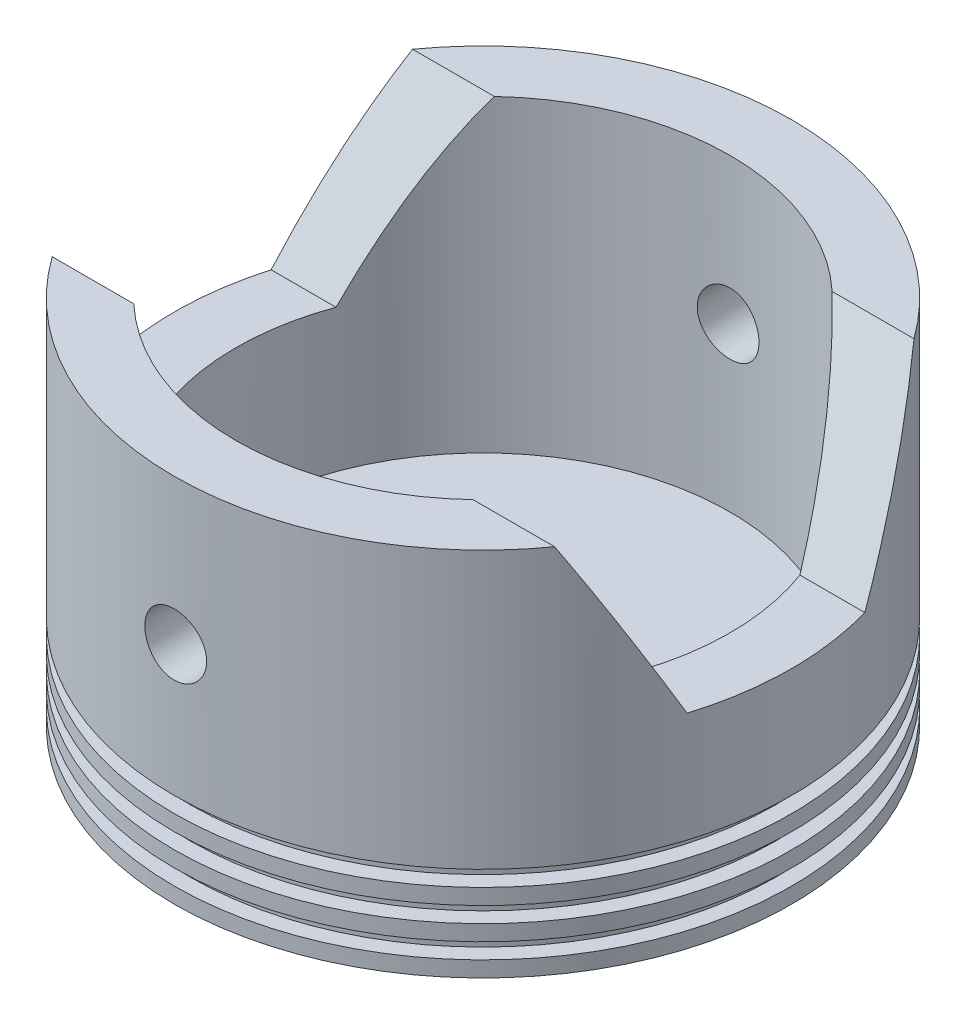
ISO-10303-21;
HEADER;
FILE_DESCRIPTION(('STEP AP214'),'2;1');
FILE_NAME('part.step','',(''),(''),'','','');
FILE_SCHEMA(('AUTOMOTIVE_DESIGN { 1 0 10303 214 1 1 1 1 }'));
ENDSEC;
DATA;
#1=APPLICATION_CONTEXT('core data for automotive mechanical design processes');
#2=APPLICATION_PROTOCOL_DEFINITION('international standard','automotive_design',2000,#1);
#3=PRODUCT_CONTEXT('',#1,'mechanical');
#4=PRODUCT('Part','Part','',(#3));
#5=PRODUCT_RELATED_PRODUCT_CATEGORY('part','',(#4));
#6=PRODUCT_DEFINITION_FORMATION('','',#4);
#7=PRODUCT_DEFINITION_CONTEXT('part definition',#1,'design');
#8=PRODUCT_DEFINITION('design','',#6,#7);
#9=PRODUCT_DEFINITION_SHAPE('','',#8);
#10=(LENGTH_UNIT() NAMED_UNIT(*) SI_UNIT(.MILLI.,.METRE.));
#11=(NAMED_UNIT(*) PLANE_ANGLE_UNIT() SI_UNIT($,.RADIAN.));
#12=(NAMED_UNIT(*) SI_UNIT($,.STERADIAN.) SOLID_ANGLE_UNIT());
#13=UNCERTAINTY_MEASURE_WITH_UNIT(LENGTH_MEASURE(1.E-05),#10,'distance_accuracy_value','');
#14=(GEOMETRIC_REPRESENTATION_CONTEXT(3) GLOBAL_UNCERTAINTY_ASSIGNED_CONTEXT((#13)) GLOBAL_UNIT_ASSIGNED_CONTEXT((#10,
#11,#12)) REPRESENTATION_CONTEXT('',''));
#15=CARTESIAN_POINT('',(0.,0.,0.));
#16=DIRECTION('',(0.,0.,1.));
#17=DIRECTION('',(1.,0.,0.));
#18=AXIS2_PLACEMENT_3D('',#15,#16,#17);
#19=CARTESIAN_POINT('',(0.,30.,0.));
#20=DIRECTION('',(0.,1.,0.));
#21=DIRECTION('',(0.,0.,1.));
#22=AXIS2_PLACEMENT_3D('',#19,#20,#21);
#23=PLANE('',#22);
#24=DIRECTION('',(1.,0.,0.));
#25=VECTOR('',#24,1.);
#26=CARTESIAN_POINT('',(-25.,30.,14.5401699052836));
#27=LINE('',#26,#25);
#28=CARTESIAN_POINT('',(-20.3367514398314,30.,14.5401699052836));
#29=VERTEX_POINT('',#28);
#30=CARTESIAN_POINT('',(-13.7325692834767,30.,14.5401699052836));
#31=VERTEX_POINT('',#30);
#32=EDGE_CURVE('E237',#29,#31,#27,.T.);
#33=ORIENTED_EDGE('',*,*,#32,.F.);
#34=CARTESIAN_POINT('',(0.,30.,0.));
#35=DIRECTION('',(0.,1.,0.));
#36=DIRECTION('',(0.,0.,1.));
#37=AXIS2_PLACEMENT_3D('',#34,#35,#36);
#38=CIRCLE('',#37,25.);
#39=CARTESIAN_POINT('',(20.3367514398314,30.,14.5401699052836));
#40=VERTEX_POINT('',#39);
#41=EDGE_CURVE('E191',#29,#40,#38,.T.);
#42=ORIENTED_EDGE('',*,*,#41,.T.);
#43=CARTESIAN_POINT('',(13.7325692834767,30.,14.5401699052836));
#44=VERTEX_POINT('',#43);
#45=EDGE_CURVE('E238',#44,#40,#27,.T.);
#46=ORIENTED_EDGE('',*,*,#45,.F.);
#47=CARTESIAN_POINT('',(0.,30.,0.));
#48=DIRECTION('',(0.,1.,0.));
#49=DIRECTION('',(0.,0.,1.));
#50=AXIS2_PLACEMENT_3D('',#47,#48,#49);
#51=CIRCLE('',#50,20.);
#52=EDGE_CURVE('E152',#31,#44,#51,.T.);
#53=ORIENTED_EDGE('',*,*,#52,.F.);
#54=EDGE_LOOP('',(#33,#42,#46,#53));
#55=FACE_BOUND('',#54,.T.);
#56=ADVANCED_FACE('F41',(#55),#23,.T.);
#57=CARTESIAN_POINT('',(0.,30.,0.));
#58=DIRECTION('',(0.,-1.,0.));
#59=DIRECTION('',(0.,0.,-1.));
#60=AXIS2_PLACEMENT_3D('',#57,#58,#59);
#61=CYLINDRICAL_SURFACE('',#60,25.);
#62=CARTESIAN_POINT('',(0.,1.27,0.));
#63=DIRECTION('',(0.,-1.,0.));
#64=DIRECTION('',(0.,0.,-1.));
#65=AXIS2_PLACEMENT_3D('',#62,#63,#64);
#66=CIRCLE('',#65,25.);
#67=CARTESIAN_POINT('',(0.,1.27,-25.));
#68=VERTEX_POINT('',#67);
#69=EDGE_CURVE('E165',#68,#68,#66,.T.);
#70=ORIENTED_EDGE('',*,*,#69,.T.);
#71=EDGE_LOOP('',(#70));
#72=FACE_BOUND('',#71,.T.);
#73=CARTESIAN_POINT('',(0.,0.,0.));
#74=DIRECTION('',(0.,1.,0.));
#75=DIRECTION('',(0.,0.,1.));
#76=AXIS2_PLACEMENT_3D('',#73,#74,#75);
#77=CIRCLE('',#76,25.);
#78=CARTESIAN_POINT('',(0.,0.,25.));
#79=VERTEX_POINT('',#78);
#80=EDGE_CURVE('E168',#79,#79,#77,.T.);
#81=ORIENTED_EDGE('',*,*,#80,.T.);
#82=EDGE_LOOP('',(#81));
#83=FACE_BOUND('',#82,.T.);
#84=ADVANCED_FACE('F264',(#72,#83),#61,.T.);
#85=CARTESIAN_POINT('',(0.,0.,0.));
#86=DIRECTION('',(0.,1.,0.));
#87=DIRECTION('',(0.,0.,1.));
#88=AXIS2_PLACEMENT_3D('',#85,#86,#87);
#89=PLANE('',#88);
#90=ORIENTED_EDGE('',*,*,#80,.F.);
#91=EDGE_LOOP('',(#90));
#92=FACE_BOUND('',#91,.T.);
#93=ADVANCED_FACE('F270',(#92),#89,.F.);
#94=CARTESIAN_POINT('',(25.,1.27,0.));
#95=DIRECTION('',(0.,-1.,0.));
#96=DIRECTION('',(0.,0.,-1.));
#97=AXIS2_PLACEMENT_3D('',#94,#95,#96);
#98=PLANE('',#97);
#99=ORIENTED_EDGE('',*,*,#69,.F.);
#100=EDGE_LOOP('',(#99));
#101=FACE_BOUND('',#100,.T.);
#102=CARTESIAN_POINT('',(0.,1.27,0.));
#103=DIRECTION('',(0.,-1.,0.));
#104=DIRECTION('',(0.,0.,-1.));
#105=AXIS2_PLACEMENT_3D('',#102,#103,#104);
#106=CIRCLE('',#105,23.73);
#107=CARTESIAN_POINT('',(0.,1.27,-23.73));
#108=VERTEX_POINT('',#107);
#109=EDGE_CURVE('E162',#108,#108,#106,.T.);
#110=ORIENTED_EDGE('',*,*,#109,.T.);
#111=EDGE_LOOP('',(#110));
#112=FACE_BOUND('',#111,.T.);
#113=ADVANCED_FACE('F338',(#101,#112),#98,.F.);
#114=CARTESIAN_POINT('',(0.,0.,0.));
#115=DIRECTION('',(0.,-1.,0.));
#116=DIRECTION('',(0.,0.,-1.));
#117=AXIS2_PLACEMENT_3D('',#114,#115,#116);
#118=CYLINDRICAL_SURFACE('',#117,23.73);
#119=ORIENTED_EDGE('',*,*,#109,.F.);
#120=EDGE_LOOP('',(#119));
#121=FACE_BOUND('',#120,.T.);
#122=CARTESIAN_POINT('',(0.,2.54,0.));
#123=DIRECTION('',(0.,-1.,0.));
#124=DIRECTION('',(0.,0.,-1.));
#125=AXIS2_PLACEMENT_3D('',#122,#123,#124);
#126=CIRCLE('',#125,23.73);
#127=CARTESIAN_POINT('',(0.,2.54,-23.73));
#128=VERTEX_POINT('',#127);
#129=EDGE_CURVE('E158',#128,#128,#126,.T.);
#130=ORIENTED_EDGE('',*,*,#129,.T.);
#131=EDGE_LOOP('',(#130));
#132=FACE_BOUND('',#131,.T.);
#133=ADVANCED_FACE('F323',(#121,#132),#118,.T.);
#134=CARTESIAN_POINT('',(25.,2.54,0.));
#135=DIRECTION('',(0.,1.,0.));
#136=DIRECTION('',(0.,0.,1.));
#137=AXIS2_PLACEMENT_3D('',#134,#135,#136);
#138=PLANE('',#137);
#139=ORIENTED_EDGE('',*,*,#129,.F.);
#140=EDGE_LOOP('',(#139));
#141=FACE_BOUND('',#140,.T.);
#142=CARTESIAN_POINT('',(0.,2.54,0.));
#143=DIRECTION('',(0.,-1.,0.));
#144=DIRECTION('',(0.,0.,-1.));
#145=AXIS2_PLACEMENT_3D('',#142,#143,#144);
#146=CIRCLE('',#145,25.);
#147=CARTESIAN_POINT('',(0.,2.54,-25.));
#148=VERTEX_POINT('',#147);
#149=EDGE_CURVE('E155',#148,#148,#146,.T.);
#150=ORIENTED_EDGE('',*,*,#149,.T.);
#151=EDGE_LOOP('',(#150));
#152=FACE_BOUND('',#151,.T.);
#153=ADVANCED_FACE('F316',(#141,#152),#138,.F.);
#154=ORIENTED_EDGE('',*,*,#149,.F.);
#155=EDGE_LOOP('',(#154));
#156=FACE_BOUND('',#155,.T.);
#157=CARTESIAN_POINT('',(0.,3.81,0.));
#158=DIRECTION('',(0.,-1.,0.));
#159=DIRECTION('',(0.,0.,-1.));
#160=AXIS2_PLACEMENT_3D('',#157,#158,#159);
#161=CIRCLE('',#160,25.);
#162=CARTESIAN_POINT('',(0.,3.81,-25.));
#163=VERTEX_POINT('',#162);
#164=EDGE_CURVE('E159',#163,#163,#161,.T.);
#165=ORIENTED_EDGE('',*,*,#164,.T.);
#166=EDGE_LOOP('',(#165));
#167=FACE_BOUND('',#166,.T.);
#168=ADVANCED_FACE('F272',(#156,#167),#61,.T.);
#169=CARTESIAN_POINT('',(25.,3.81,0.));
#170=DIRECTION('',(0.,-1.,0.));
#171=DIRECTION('',(0.,0.,-1.));
#172=AXIS2_PLACEMENT_3D('',#169,#170,#171);
#173=PLANE('',#172);
#174=ORIENTED_EDGE('',*,*,#164,.F.);
#175=EDGE_LOOP('',(#174));
#176=FACE_BOUND('',#175,.T.);
#177=CARTESIAN_POINT('',(0.,3.81,0.));
#178=DIRECTION('',(0.,-1.,0.));
#179=DIRECTION('',(0.,0.,-1.));
#180=AXIS2_PLACEMENT_3D('',#177,#178,#179);
#181=CIRCLE('',#180,23.73);
#182=CARTESIAN_POINT('',(0.,3.81,-23.73));
#183=VERTEX_POINT('',#182);
#184=EDGE_CURVE('E176',#183,#183,#181,.T.);
#185=ORIENTED_EDGE('',*,*,#184,.T.);
#186=EDGE_LOOP('',(#185));
#187=FACE_BOUND('',#186,.T.);
#188=ADVANCED_FACE('F294',(#176,#187),#173,.F.);
#189=CARTESIAN_POINT('',(0.,0.,0.));
#190=DIRECTION('',(0.,-1.,0.));
#191=DIRECTION('',(0.,0.,-1.));
#192=AXIS2_PLACEMENT_3D('',#189,#190,#191);
#193=CYLINDRICAL_SURFACE('',#192,23.73);
#194=ORIENTED_EDGE('',*,*,#184,.F.);
#195=EDGE_LOOP('',(#194));
#196=FACE_BOUND('',#195,.T.);
#197=CARTESIAN_POINT('',(0.,5.08,0.));
#198=DIRECTION('',(0.,-1.,0.));
#199=DIRECTION('',(0.,0.,-1.));
#200=AXIS2_PLACEMENT_3D('',#197,#198,#199);
#201=CIRCLE('',#200,23.73);
#202=CARTESIAN_POINT('',(0.,5.08,-23.73));
#203=VERTEX_POINT('',#202);
#204=EDGE_CURVE('E172',#203,#203,#201,.T.);
#205=ORIENTED_EDGE('',*,*,#204,.T.);
#206=EDGE_LOOP('',(#205));
#207=FACE_BOUND('',#206,.T.);
#208=ADVANCED_FACE('F311',(#196,#207),#193,.T.);
#209=CARTESIAN_POINT('',(25.,5.08,0.));
#210=DIRECTION('',(0.,1.,0.));
#211=DIRECTION('',(0.,0.,1.));
#212=AXIS2_PLACEMENT_3D('',#209,#210,#211);
#213=PLANE('',#212);
#214=ORIENTED_EDGE('',*,*,#204,.F.);
#215=EDGE_LOOP('',(#214));
#216=FACE_BOUND('',#215,.T.);
#217=CARTESIAN_POINT('',(0.,5.08,0.));
#218=DIRECTION('',(0.,-1.,0.));
#219=DIRECTION('',(0.,0.,-1.));
#220=AXIS2_PLACEMENT_3D('',#217,#218,#219);
#221=CIRCLE('',#220,25.);
#222=CARTESIAN_POINT('',(0.,5.08,-25.));
#223=VERTEX_POINT('',#222);
#224=EDGE_CURVE('E169',#223,#223,#221,.T.);
#225=ORIENTED_EDGE('',*,*,#224,.T.);
#226=EDGE_LOOP('',(#225));
#227=FACE_BOUND('',#226,.T.);
#228=ADVANCED_FACE('F301',(#216,#227),#213,.F.);
#229=ORIENTED_EDGE('',*,*,#224,.F.);
#230=EDGE_LOOP('',(#229));
#231=FACE_BOUND('',#230,.T.);
#232=CARTESIAN_POINT('',(0.,6.35,0.));
#233=DIRECTION('',(0.,-1.,0.));
#234=DIRECTION('',(0.,0.,-1.));
#235=AXIS2_PLACEMENT_3D('',#232,#233,#234);
#236=CIRCLE('',#235,25.);
#237=CARTESIAN_POINT('',(0.,6.35,-25.));
#238=VERTEX_POINT('',#237);
#239=EDGE_CURVE('E173',#238,#238,#236,.T.);
#240=ORIENTED_EDGE('',*,*,#239,.T.);
#241=EDGE_LOOP('',(#240));
#242=FACE_BOUND('',#241,.T.);
#243=ADVANCED_FACE('F280',(#231,#242),#61,.T.);
#244=CARTESIAN_POINT('',(25.,6.35,0.));
#245=DIRECTION('',(0.,-1.,0.));
#246=DIRECTION('',(0.,0.,-1.));
#247=AXIS2_PLACEMENT_3D('',#244,#245,#246);
#248=PLANE('',#247);
#249=ORIENTED_EDGE('',*,*,#239,.F.);
#250=EDGE_LOOP('',(#249));
#251=FACE_BOUND('',#250,.T.);
#252=CARTESIAN_POINT('',(0.,6.35,0.));
#253=DIRECTION('',(0.,-1.,0.));
#254=DIRECTION('',(0.,0.,-1.));
#255=AXIS2_PLACEMENT_3D('',#252,#253,#254);
#256=CIRCLE('',#255,23.73);
#257=CARTESIAN_POINT('',(0.,6.35,-23.73));
#258=VERTEX_POINT('',#257);
#259=EDGE_CURVE('E186',#258,#258,#256,.T.);
#260=ORIENTED_EDGE('',*,*,#259,.T.);
#261=EDGE_LOOP('',(#260));
#262=FACE_BOUND('',#261,.T.);
#263=ADVANCED_FACE('F288',(#251,#262),#248,.F.);
#264=CARTESIAN_POINT('',(0.,0.,0.));
#265=DIRECTION('',(0.,-1.,0.));
#266=DIRECTION('',(0.,0.,-1.));
#267=AXIS2_PLACEMENT_3D('',#264,#265,#266);
#268=CYLINDRICAL_SURFACE('',#267,23.73);
#269=ORIENTED_EDGE('',*,*,#259,.F.);
#270=EDGE_LOOP('',(#269));
#271=FACE_BOUND('',#270,.T.);
#272=CARTESIAN_POINT('',(0.,7.62,0.));
#273=DIRECTION('',(0.,-1.,0.));
#274=DIRECTION('',(0.,0.,-1.));
#275=AXIS2_PLACEMENT_3D('',#272,#273,#274);
#276=CIRCLE('',#275,23.73);
#277=CARTESIAN_POINT('',(0.,7.62,-23.73));
#278=VERTEX_POINT('',#277);
#279=EDGE_CURVE('E183',#278,#278,#276,.T.);
#280=ORIENTED_EDGE('',*,*,#279,.T.);
#281=EDGE_LOOP('',(#280));
#282=FACE_BOUND('',#281,.T.);
#283=ADVANCED_FACE('F282',(#271,#282),#268,.T.);
#284=CARTESIAN_POINT('',(25.,7.62,0.));
#285=DIRECTION('',(0.,1.,0.));
#286=DIRECTION('',(0.,0.,1.));
#287=AXIS2_PLACEMENT_3D('',#284,#285,#286);
#288=PLANE('',#287);
#289=ORIENTED_EDGE('',*,*,#279,.F.);
#290=EDGE_LOOP('',(#289));
#291=FACE_BOUND('',#290,.T.);
#292=CARTESIAN_POINT('',(0.,7.62,0.));
#293=DIRECTION('',(0.,-1.,0.));
#294=DIRECTION('',(0.,0.,-1.));
#295=AXIS2_PLACEMENT_3D('',#292,#293,#294);
#296=CIRCLE('',#295,25.);
#297=CARTESIAN_POINT('',(0.,7.62,-25.));
#298=VERTEX_POINT('',#297);
#299=EDGE_CURVE('E150',#298,#298,#296,.T.);
#300=ORIENTED_EDGE('',*,*,#299,.T.);
#301=EDGE_LOOP('',(#300));
#302=FACE_BOUND('',#301,.T.);
#303=ADVANCED_FACE('F275',(#291,#302),#288,.F.);
#304=DIRECTION('',(1.,0.,0.));
#305=VECTOR('',#304,1.);
#306=CARTESIAN_POINT('',(-25.,30.,-14.5941222982531));
#307=LINE('',#306,#305);
#308=CARTESIAN_POINT('',(13.6752182557951,30.,-14.5941222982531));
#309=VERTEX_POINT('',#308);
#310=CARTESIAN_POINT('',(20.2980687343312,30.,-14.5941222982531));
#311=VERTEX_POINT('',#310);
#312=EDGE_CURVE('E137',#309,#311,#307,.T.);
#313=ORIENTED_EDGE('',*,*,#312,.T.);
#314=CARTESIAN_POINT('',(-20.2980687343312,30.,-14.5941222982531));
#315=VERTEX_POINT('',#314);
#316=EDGE_CURVE('E194',#311,#315,#38,.T.);
#317=ORIENTED_EDGE('',*,*,#316,.T.);
#318=CARTESIAN_POINT('',(-13.6752182557951,30.,-14.5941222982531));
#319=VERTEX_POINT('',#318);
#320=EDGE_CURVE('E131',#315,#319,#307,.T.);
#321=ORIENTED_EDGE('',*,*,#320,.T.);
#322=EDGE_CURVE('E151',#309,#319,#51,.T.);
#323=ORIENTED_EDGE('',*,*,#322,.F.);
#324=EDGE_LOOP('',(#313,#317,#321,#323));
#325=FACE_BOUND('',#324,.T.);
#326=ADVANCED_FACE('F246',(#325),#23,.T.);
#327=CARTESIAN_POINT('',(0.,20.710167381686,-25.));
#328=CARTESIAN_POINT('',(-0.140050884478893,20.710161316935,-24.9999983880192));
#329=CARTESIAN_POINT('',(-0.280194362919433,20.6983592094449,-24.9988106399051));
#330=CARTESIAN_POINT('',(-0.556595996242093,20.6514564559599,-24.9941866898684));
#331=CARTESIAN_POINT('',(-0.69284969792207,20.6163301416245,-24.9907480108506));
#332=CARTESIAN_POINT('',(-0.957429188633536,20.5238117801914,-24.9820103640768));
#333=CARTESIAN_POINT('',(-1.08575971153727,20.4664331803898,-24.9767125200177));
#334=CARTESIAN_POINT('',(-1.33094040240101,20.3310651118569,-24.9648489348577));
#335=CARTESIAN_POINT('',(-1.44779284694769,20.2530797416856,-24.9582834459533));
#336=CARTESIAN_POINT('',(-1.6671488766852,20.0784106375303,-24.9445936085331));
#337=CARTESIAN_POINT('',(-1.76960536208723,19.9816678831809,-24.9374675393466));
#338=CARTESIAN_POINT('',(-1.95685630357746,19.7723560460284,-24.9234739226566));
#339=CARTESIAN_POINT('',(-2.04164994270663,19.65978623158,-24.9166063871229));
#340=CARTESIAN_POINT('',(-2.19133492610904,19.4217210524769,-24.9038897888196));
#341=CARTESIAN_POINT('',(-2.2561836636372,19.2961987714488,-24.8980429177726));
#342=CARTESIAN_POINT('',(-2.3638659618569,19.0359784169235,-24.8880509386631));
#343=CARTESIAN_POINT('',(-2.40670006647823,18.9012805702261,-24.8839057885556));
#344=CARTESIAN_POINT('',(-2.46899760400473,18.627012879521,-24.8778021018244));
#345=CARTESIAN_POINT('',(-2.48853913250949,18.4874609395555,-24.8758362599524));
#346=CARTESIAN_POINT('',(-2.5039382128384,18.2070452231965,-24.8742910765131));
#347=CARTESIAN_POINT('',(-2.499796387177,18.0661814813808,-24.8747116722186));
#348=CARTESIAN_POINT('',(-2.4680107006317,17.7876791074527,-24.8778851724734));
#349=CARTESIAN_POINT('',(-2.44045211031138,17.6500306333642,-24.8806296147663));
#350=CARTESIAN_POINT('',(-2.36274786037646,17.3813224736832,-24.8881283571855));
#351=CARTESIAN_POINT('',(-2.31260189563936,17.2502628771234,-24.8928826844623));
#352=CARTESIAN_POINT('',(-2.19105223470377,16.9981834134388,-24.9038752363018));
#353=CARTESIAN_POINT('',(-2.11961070679995,16.8771819079627,-24.9101160977039));
#354=CARTESIAN_POINT('',(-1.95752506838307,16.6488543444063,-24.923376293322));
#355=CARTESIAN_POINT('',(-1.86688039584126,16.5415286867316,-24.9303956503196));
#356=CARTESIAN_POINT('',(-1.66848528103017,16.3431038967134,-24.9444596328247));
#357=CARTESIAN_POINT('',(-1.56066119712841,16.252078376984,-24.9515042333249));
#358=CARTESIAN_POINT('',(-1.33122370434278,16.08940829941,-24.964795726963));
#359=CARTESIAN_POINT('',(-1.209610279999,16.0177637632948,-24.9710426192064));
#360=CARTESIAN_POINT('',(-0.955995264230911,15.8958923309103,-24.9820368916774));
#361=CARTESIAN_POINT('',(-0.823991865974757,15.8456691696408,-24.9867840103692));
#362=CARTESIAN_POINT('',(-0.553368043324829,15.7681200899066,-24.9942411860352));
#363=CARTESIAN_POINT('',(-0.414747816941501,15.7407934867094,-24.9969513039266));
#364=CARTESIAN_POINT('',(-0.13546274772976,15.7099066123491,-25.0000212917078));
#365=CARTESIAN_POINT('',(0.00519075526372853,15.7062447610547,-25.0003912066934));
#366=CARTESIAN_POINT('',(0.285109483289248,15.7225245393079,-24.9987660439199));
#367=CARTESIAN_POINT('',(0.424374727051174,15.7424658499742,-24.9967709981117));
#368=CARTESIAN_POINT('',(0.697270517086686,15.8053016202399,-24.9906465384799));
#369=CARTESIAN_POINT('',(0.830912122430047,15.848148517881,-24.986521547951));
#370=CARTESIAN_POINT('',(1.08911080345945,15.9555303167792,-24.9765999715152));
#371=CARTESIAN_POINT('',(1.21366767539279,16.0200657042845,-24.9708033481313));
#372=CARTESIAN_POINT('',(1.45062045043036,16.1692444783458,-24.9581618832606));
#373=CARTESIAN_POINT('',(1.56297414937229,16.2539546040005,-24.951313590086));
#374=CARTESIAN_POINT('',(1.77190405827969,16.4409825510383,-24.937348321738));
#375=CARTESIAN_POINT('',(1.86847987212294,16.5433008143618,-24.9302313398243));
#376=CARTESIAN_POINT('',(2.04346527471786,16.7630838183335,-24.9165006035189));
#377=CARTESIAN_POINT('',(2.12180819669886,16.8806017730425,-24.9098887534744));
#378=CARTESIAN_POINT('',(2.25764564685957,17.1271857820527,-24.8979458115222));
#379=CARTESIAN_POINT('',(2.3151404601347,17.256251678407,-24.8926147021009));
#380=CARTESIAN_POINT('',(2.40753802171119,17.5220392303505,-24.8838486908512));
#381=CARTESIAN_POINT('',(2.44248043702965,17.6587469819138,-24.8804104612447));
#382=CARTESIAN_POINT('',(2.48891001782366,17.9361253765879,-24.8758091320719));
#383=CARTESIAN_POINT('',(2.50039785599879,18.0767959059252,-24.8746459672547));
#384=CARTESIAN_POINT('',(2.49958284617814,18.3574441025777,-24.8747278276891));
#385=CARTESIAN_POINT('',(2.48738472398278,18.497422088893,-24.8759622521752));
#386=CARTESIAN_POINT('',(2.43976363240913,18.7733296746067,-24.8806775972386));
#387=CARTESIAN_POINT('',(2.4043406369054,18.9092592694509,-24.884158520343));
#388=CARTESIAN_POINT('',(2.31130421574376,19.1732107543056,-24.8929717065797));
#389=CARTESIAN_POINT('',(2.25369386085229,19.3012337357603,-24.898303713509));
#390=CARTESIAN_POINT('',(2.11792888727761,19.5458096108636,-24.910218795984));
#391=CARTESIAN_POINT('',(2.03977438363854,19.6623625687376,-24.9168018645238));
#392=CARTESIAN_POINT('',(1.86474639071333,19.8812265678658,-24.9305121802424));
#393=CARTESIAN_POINT('',(1.76779487222567,19.9834750726037,-24.9376416181688));
#394=CARTESIAN_POINT('',(1.55807924806277,20.1702979634351,-24.9516213682196));
#395=CARTESIAN_POINT('',(1.44531136027064,20.2548681100789,-24.9584716130744));
#396=CARTESIAN_POINT('',(1.20685358540322,20.4041010163225,-24.971139051729));
#397=CARTESIAN_POINT('',(1.08113187336691,20.4687131090489,-24.9769536006703));
#398=CARTESIAN_POINT('',(0.820645697751376,20.5758234387457,-24.9868657312474));
#399=CARTESIAN_POINT('',(0.685891624564024,20.6183466090699,-24.9909652477413));
#400=CARTESIAN_POINT('',(0.458645653514262,20.669468924398,-24.9959553443433));
#401=CARTESIAN_POINT('',(0.367606382111273,20.6847099924344,-24.9974650172958));
#402=CARTESIAN_POINT('',(0.184391452043283,20.7050611968404,-24.9994878737697));
#403=CARTESIAN_POINT('',(0.0922157980663951,20.7101713749906,-25.0000010614006));
#404=CARTESIAN_POINT('',(0.,20.710167381686,-25.));
#405=B_SPLINE_CURVE_WITH_KNOTS('',3,(#327,#328,#329,#330,#331,#332,#333,#334,#335,#336,#337,
#338,#339,#340,#341,#342,#343,#344,#345,#346,#347,#348,#349,#350,#351,#352,#353,#354,#355,#356,
#357,#358,#359,#360,#361,#362,#363,#364,#365,#366,#367,#368,#369,#370,#371,#372,#373,#374,#375,
#376,#377,#378,#379,#380,#381,#382,#383,#384,#385,#386,#387,#388,#389,#390,#391,#392,#393,#394,
#395,#396,#397,#398,#399,#400,#401,#402,#403,#404),.UNSPECIFIED.,.T.,.F.,(4,2,2,2,2,2,2,2,2,2,2,
2,2,2,2,2,2,2,2,2,2,2,2,2,2,2,2,2,2,2,2,2,2,2,2,2,2,2,4),(0.,0.419815915671185,
0.840094607088715,1.2601197143305,1.68006134395696,2.10134642155736,2.52265098051764,
2.94484938680555,3.3670373610626,3.78780580112992,4.20856318139441,4.62779493602777,
5.04703235404084,5.46701903432237,5.88701800827813,6.30886835490516,6.73071917449429,
7.15264351733954,7.57455524188599,7.99465471519394,8.41474851297858,8.83397338235762,
9.25320765123667,9.67384851871746,10.0944999452557,10.516666090215,10.9388264618844,
11.3602422648251,11.7816459809896,12.2011907323489,12.620735955651,13.04022313407,
13.459707963474,13.8809729356913,14.3023388159239,14.7247657756561,15.1467148698824,
15.4231416808087,15.6995673517257),.UNSPECIFIED.);
#406=CARTESIAN_POINT('',(0.,20.710167381686,-25.));
#407=VERTEX_POINT('',#406);
#408=EDGE_CURVE('E141',#407,#407,#405,.T.);
#409=ORIENTED_EDGE('',*,*,#408,.T.);
#410=EDGE_LOOP('',(#409));
#411=FACE_BOUND('',#410,.T.);
#412=CARTESIAN_POINT('',(2.5,18.210167381686,24.8746859276655));
#413=CARTESIAN_POINT('',(2.49999393348378,18.070118471252,24.8746875699226));
#414=CARTESIAN_POINT('',(2.48819214745619,17.9299769606564,24.8758814248555));
#415=CARTESIAN_POINT('',(2.4412907869089,17.6535794159521,24.880527188953));
#416=CARTESIAN_POINT('',(2.40616553721609,17.5173278365923,24.8839815865305));
#417=CARTESIAN_POINT('',(2.31365029017232,17.2527528336412,24.8927533261847));
#418=CARTESIAN_POINT('',(2.25627379073475,17.1244246582074,24.8980695386697));
#419=CARTESIAN_POINT('',(2.12091066847775,16.8792479009566,24.9099645142955));
#420=CARTESIAN_POINT('',(2.04292813906482,16.7623970454767,24.9165430266082));
#421=CARTESIAN_POINT('',(1.86826190499676,16.5430392225422,24.9302481677475));
#422=CARTESIAN_POINT('',(1.77151854527065,16.4405798579265,24.9373765001317));
#423=CARTESIAN_POINT('',(1.56220428829891,16.2533233591771,24.951362630893));
#424=CARTESIAN_POINT('',(1.44963266726642,16.1685270331702,24.9582204168803));
#425=CARTESIAN_POINT('',(1.21156590412747,16.0188392391681,24.9709095788901));
#426=CARTESIAN_POINT('',(1.08604415632392,15.9539898847018,24.9767387723662));
#427=CARTESIAN_POINT('',(0.825824960718777,15.8463062988143,24.9866954218943));
#428=CARTESIAN_POINT('',(0.691127736670548,15.8034715307623,24.9908229194266));
#429=CARTESIAN_POINT('',(0.416861956857375,15.7411726083029,24.9968991642756));
#430=CARTESIAN_POINT('',(0.277311317578955,15.7216302998111,24.9988551960704));
#431=CARTESIAN_POINT('',(-0.00310185172235647,15.7062292088517,25.0003928899673));
#432=CARTESIAN_POINT('',(-0.143964347636152,15.7103698123203,24.9999746136318));
#433=CARTESIAN_POINT('',(-0.422472110161399,15.7421535633114,24.9968167827796));
#434=CARTESIAN_POINT('',(-0.560127074837446,15.7697126705957,24.9940855287928));
#435=CARTESIAN_POINT('',(-0.828847948761331,15.8474202040525,24.9866182316233));
#436=CARTESIAN_POINT('',(-0.95991377239432,15.8975689236549,24.9818821623988));
#437=CARTESIAN_POINT('',(-1.21200078669896,16.0191242898221,24.9709234370979));
#438=CARTESIAN_POINT('',(-1.33300392745412,16.0905681255114,24.9646981841439));
#439=CARTESIAN_POINT('',(-1.56133378293548,16.2526586900269,24.9514596129852));
#440=CARTESIAN_POINT('',(-1.66866009640207,16.3433059820489,24.9444462716703));
#441=CARTESIAN_POINT('',(-1.86708192955672,16.5417029554701,24.9303823366963));
#442=CARTESIAN_POINT('',(-1.95810436547586,16.6495257435399,24.9233317143257));
#443=CARTESIAN_POINT('',(-2.12076883839479,16.8789595447129,24.9100184982056));
#444=CARTESIAN_POINT('',(-2.19241084728222,17.0005705778163,24.9037559055991));
#445=CARTESIAN_POINT('',(-2.31428046143307,17.2541849446855,24.8927272378537));
#446=CARTESIAN_POINT('',(-2.3645035514324,17.3861904627432,24.8879614783139));
#447=CARTESIAN_POINT('',(-2.44205183909397,17.6568188932227,24.8804725467734));
#448=CARTESIAN_POINT('',(-2.46937773435758,17.7954416039046,24.8777493125442));
#449=CARTESIAN_POINT('',(-2.5002619384799,18.0747278305097,24.8746645131854));
#450=CARTESIAN_POINT('',(-2.50392249161803,18.2153799323481,24.8742927886901));
#451=CARTESIAN_POINT('',(-2.48764061717841,18.4952955462431,24.8759262838693));
#452=CARTESIAN_POINT('',(-2.46769850852438,18.6345590770369,24.8779314714265));
#453=CARTESIAN_POINT('',(-2.4048629362688,18.9074463373818,24.88408361056));
#454=CARTESIAN_POINT('',(-2.36201781797227,19.0410813094226,24.8882260500336));
#455=CARTESIAN_POINT('',(-2.25464179918985,19.2992675110117,24.8981822759699));
#456=CARTESIAN_POINT('',(-2.19011040195897,19.4238185324039,24.9039961007167));
#457=CARTESIAN_POINT('',(-2.04093750355804,19.6607673167579,24.9166646088928));
#458=CARTESIAN_POINT('',(-1.95622824960173,19.7731222366016,24.9235227703668));
#459=CARTESIAN_POINT('',(-1.76920133362794,19.9820550148711,24.9374958156297));
#460=CARTESIAN_POINT('',(-1.66688323562034,20.0786324825362,24.9446107057716));
#461=CARTESIAN_POINT('',(-1.44709951056618,20.2536214651812,24.9583261962325));
#462=CARTESIAN_POINT('',(-1.32958063992363,20.3319662806515,24.9649248513869));
#463=CARTESIAN_POINT('',(-1.08299429354283,20.467807052952,24.9768360526658));
#464=CARTESIAN_POINT('',(-0.953926976074064,20.5253032954537,24.9821486164123));
#465=CARTESIAN_POINT('',(-0.688140316082038,20.6177018008243,24.9908802603501));
#466=CARTESIAN_POINT('',(-0.5514350941249,20.652644349999,24.9943027151412));
#467=CARTESIAN_POINT('',(-0.2740620349592,20.6990750556356,24.9988823653412));
#468=CARTESIAN_POINT('',(-0.133394309230546,20.7105638712711,25.0000396244141));
#469=CARTESIAN_POINT('',(0.147255560189365,20.7097517155861,24.9999584578317));
#470=CARTESIAN_POINT('',(0.287238018061318,20.6975542895943,24.9987304594167));
#471=CARTESIAN_POINT('',(0.563154720890905,20.6499330175435,24.9940373394398));
#472=CARTESIAN_POINT('',(0.699088962670913,20.6145091532536,24.9905722161218));
#473=CARTESIAN_POINT('',(0.963049771919358,20.5214692382037,24.981793095349));
#474=CARTESIAN_POINT('',(1.09107741519382,20.4638562143506,24.9764793500812));
#475=CARTESIAN_POINT('',(1.33566150038699,20.3280844593935,24.9645953104074));
#476=CARTESIAN_POINT('',(1.4522180094214,20.2499258485082,24.9580250233539));
#477=CARTESIAN_POINT('',(1.67108181106735,20.0748933341266,24.9443296167264));
#478=CARTESIAN_POINT('',(1.77332731554835,19.977942341074,24.9372022865175));
#479=CARTESIAN_POINT('',(1.96014439848285,19.7682290028224,24.9232147692415));
#480=CARTESIAN_POINT('',(2.04471172961962,19.6554628687633,24.9163546466944));
#481=CARTESIAN_POINT('',(2.19394160106013,19.4170065268862,24.903659585265));
#482=CARTESIAN_POINT('',(2.25855296998709,19.2912841783758,24.8978272981327));
#483=CARTESIAN_POINT('',(2.36566177024692,19.0307966535704,24.8878798690615));
#484=CARTESIAN_POINT('',(2.40818414472464,18.8960418718717,24.883762791334));
#485=CARTESIAN_POINT('',(2.45930422083382,18.6687980294382,24.8787501884536));
#486=CARTESIAN_POINT('',(2.47454428099556,18.5777617534199,24.8772332983924));
#487=CARTESIAN_POINT('',(2.49489414651278,18.3945528240796,24.8752006294416));
#488=CARTESIAN_POINT('',(2.50000399439316,18.3023801755295,24.8746848463496));
#489=CARTESIAN_POINT('',(2.5,18.210167381686,24.8746859276655));
#490=B_SPLINE_CURVE_WITH_KNOTS('',3,(#412,#413,#414,#415,#416,#417,#418,#419,#420,#421,#422,
#423,#424,#425,#426,#427,#428,#429,#430,#431,#432,#433,#434,#435,#436,#437,#438,#439,#440,#441,
#442,#443,#444,#445,#446,#447,#448,#449,#450,#451,#452,#453,#454,#455,#456,#457,#458,#459,#460,
#461,#462,#463,#464,#465,#466,#467,#468,#469,#470,#471,#472,#473,#474,#475,#476,#477,#478,#479,
#480,#481,#482,#483,#484,#485,#486,#487,#488,#489),.UNSPECIFIED.,.T.,.F.,(4,2,2,2,2,2,2,2,2,2,2,
2,2,2,2,2,2,2,2,2,2,2,2,2,2,2,2,2,2,2,2,2,2,2,2,2,2,2,4),(0.,0.419809986091155,
0.840082879554424,1.26010122749368,1.68003620105329,2.10132903824813,2.52264114638132,
2.94483674928229,3.36702206019487,3.78778677246124,4.20854057495581,4.62779079546654,
5.04704646202436,5.46703863666033,5.88704313046322,6.30888562712503,6.73072873568907,
7.15266072794834,7.57457986487582,7.99467490769413,8.41476427417175,8.83397036761317,
9.25318606402618,9.67382974529295,10.0944838430801,10.516653420453,10.9388172129501,
11.360224817359,11.7816205778287,12.2011783367121,12.6207364249165,13.0402372998812,
13.45973572027,13.8809928759497,14.3023511258631,14.7247810267619,15.14673287235,
15.4231506901512,15.6995673475954),.UNSPECIFIED.);
#491=CARTESIAN_POINT('',(2.5,18.210167381686,24.8746859276655));
#492=VERTEX_POINT('',#491);
#493=EDGE_CURVE('E225',#492,#492,#490,.T.);
#494=ORIENTED_EDGE('',*,*,#493,.T.);
#495=EDGE_LOOP('',(#494));
#496=FACE_BOUND('',#495,.T.);
#497=ORIENTED_EDGE('',*,*,#299,.F.);
#498=EDGE_LOOP('',(#497));
#499=FACE_BOUND('',#498,.T.);
#500=ORIENTED_EDGE('',*,*,#316,.F.);
#501=CARTESIAN_POINT('',(0.,4.50781086980999,0.));
#502=DIRECTION('',(0.,-0.496835726950232,-0.86784460615126));
#503=DIRECTION('',(0.,-0.86784460615126,0.496835726950232));
#504=AXIS2_PLACEMENT_3D('',#501,#502,#503);
#505=ELLIPSE('',#504,50.3184425835469,25.);
#506=CARTESIAN_POINT('',(24.0349811863794,16.5235377241509,-6.87893010361281));
#507=VERTEX_POINT('',#506);
#508=EDGE_CURVE('E132',#311,#507,#505,.T.);
#509=ORIENTED_EDGE('',*,*,#508,.T.);
#510=CARTESIAN_POINT('',(0.,16.5235377241509,0.));
#511=DIRECTION('',(0.,-1.,0.));
#512=DIRECTION('',(0.,0.,-1.));
#513=AXIS2_PLACEMENT_3D('',#510,#511,#512);
#514=CIRCLE('',#513,25.);
#515=CARTESIAN_POINT('',(23.8906700531704,16.5235377241509,7.36450164033842));
#516=VERTEX_POINT('',#515);
#517=EDGE_CURVE('E123',#507,#516,#514,.T.);
#518=ORIENTED_EDGE('',*,*,#517,.T.);
#519=CARTESIAN_POINT('',(0.,2.69243170420056,0.));
#520=DIRECTION('',(0.,-0.469987518979875,0.882673060653344));
#521=DIRECTION('',(0.,-0.882673060653344,-0.469987518979875));
#522=AXIS2_PLACEMENT_3D('',#519,#520,#521);
#523=ELLIPSE('',#522,53.1929019184667,25.);
#524=EDGE_CURVE('E146',#516,#40,#523,.T.);
#525=ORIENTED_EDGE('',*,*,#524,.T.);
#526=ORIENTED_EDGE('',*,*,#41,.F.);
#527=CARTESIAN_POINT('',(-23.8906700531704,16.5235377241509,7.36450164033842));
#528=VERTEX_POINT('',#527);
#529=EDGE_CURVE('E121',#29,#528,#523,.T.);
#530=ORIENTED_EDGE('',*,*,#529,.T.);
#531=CARTESIAN_POINT('',(-24.0349811863794,16.5235377241509,-6.87893010361281));
#532=VERTEX_POINT('',#531);
#533=EDGE_CURVE('E115',#528,#532,#514,.T.);
#534=ORIENTED_EDGE('',*,*,#533,.T.);
#535=EDGE_CURVE('E118',#532,#315,#505,.T.);
#536=ORIENTED_EDGE('',*,*,#535,.T.);
#537=EDGE_LOOP('',(#500,#509,#518,#525,#526,#530,#534,#536));
#538=FACE_BOUND('',#537,.T.);
#539=ADVANCED_FACE('F43',(#411,#496,#499,#538),#61,.T.);
#540=CARTESIAN_POINT('',(0.,5.,0.));
#541=DIRECTION('',(0.,1.,0.));
#542=DIRECTION('',(0.,0.,1.));
#543=AXIS2_PLACEMENT_3D('',#540,#541,#542);
#544=CYLINDRICAL_SURFACE('',#543,20.);
#545=CARTESIAN_POINT('',(0.,15.710167381686,20.));
#546=CARTESIAN_POINT('',(0.139841095555761,15.7101733226217,19.9999980489643));
#547=CARTESIAN_POINT('',(0.279769574302747,15.7219402608553,19.998517845549));
#548=CARTESIAN_POINT('',(0.555732802089753,15.7686951362568,19.9927554011136));
#549=CARTESIAN_POINT('',(0.691763330623745,15.8037073196094,19.9884702344143));
#550=CARTESIAN_POINT('',(0.955895574813054,15.8959050256001,19.9775806104441));
#551=CARTESIAN_POINT('',(1.08400256014614,15.9530756234958,19.9709777145554));
#552=CARTESIAN_POINT('',(1.32877947489304,16.0879346656558,19.956187008781));
#553=CARTESIAN_POINT('',(1.44545136155637,16.1656195902167,19.9479994708412));
#554=CARTESIAN_POINT('',(1.66471281693132,16.3397593315256,19.9309032130633));
#555=CARTESIAN_POINT('',(1.76723036493713,16.4363045110322,19.9219911469242));
#556=CARTESIAN_POINT('',(1.95465279355749,16.6452302052226,19.9044772600975));
#557=CARTESIAN_POINT('',(2.03955677639225,16.7576115265992,19.8958754552427));
#558=CARTESIAN_POINT('',(2.18961016128394,16.9954873592516,19.8799230561958));
#559=CARTESIAN_POINT('',(2.25469209594107,17.1210247432539,19.8725767717791));
#560=CARTESIAN_POINT('',(2.36282307657511,17.3813544336333,19.8600112845768));
#561=CARTESIAN_POINT('',(2.40587295806521,17.516146388833,19.8547920011314));
#562=CARTESIAN_POINT('',(2.46849898002476,17.7904115772727,19.8471033960361));
#563=CARTESIAN_POINT('',(2.4881967147317,17.9298566393902,19.8446198343674));
#564=CARTESIAN_POINT('',(2.50393554955723,18.2100936451578,19.8426402814279));
#565=CARTESIAN_POINT('',(2.49997760100242,18.3508855344173,19.8431441700151));
#566=CARTESIAN_POINT('',(2.4686172364479,18.6289722089348,19.8470695536975));
#567=CARTESIAN_POINT('',(2.4413487629847,18.7662823678862,19.8504743796033));
#568=CARTESIAN_POINT('',(2.36435038318205,19.034362402905,19.8597919975763));
#569=CARTESIAN_POINT('',(2.3146200217519,19.1651321464,19.8657048404572));
#570=CARTESIAN_POINT('',(2.19396555991165,19.4168353807077,19.8793911586465));
#571=CARTESIAN_POINT('',(2.12298325370764,19.537740681935,19.8871697321144));
#572=CARTESIAN_POINT('',(1.96188146945692,19.7659740760992,19.903707114306));
#573=CARTESIAN_POINT('',(1.87176111608078,19.8733015476597,19.9124659678566));
#574=CARTESIAN_POINT('',(1.67419911075378,20.0721100924087,19.9300510989042));
#575=CARTESIAN_POINT('',(1.56664200784001,20.163476473452,19.9388774238689));
#576=CARTESIAN_POINT('',(1.33765716911393,20.3268762617165,19.9555463255585));
#577=CARTESIAN_POINT('',(1.21622940131825,20.398909624358,19.9633889000151));
#578=CARTESIAN_POINT('',(0.962861671363483,20.5215987021499,19.9772115221858));
#579=CARTESIAN_POINT('',(0.830918195337719,20.5722472355672,19.9831909440154));
#580=CARTESIAN_POINT('',(0.560307940431057,20.6506378752092,19.9926078578006));
#581=CARTESIAN_POINT('',(0.421641476630667,20.678381053823,19.9960454687587));
#582=CARTESIAN_POINT('',(0.142513163913497,20.7100248059465,19.9999759641076));
#583=CARTESIAN_POINT('',(0.00206949019860637,20.71408337405,20.0004883614264));
#584=CARTESIAN_POINT('',(-0.277496036497496,20.69865964763,19.9985633800543));
#585=CARTESIAN_POINT('',(-0.416617917564707,20.6791778544344,19.9961260641821));
#586=CARTESIAN_POINT('',(-0.689124507721522,20.6173576729116,19.9885876875669));
#587=CARTESIAN_POINT('',(-0.822526570424705,20.5750946182833,19.9834954081387));
#588=CARTESIAN_POINT('',(-1.08034965485841,20.4689899297731,19.971217231002));
#589=CARTESIAN_POINT('',(-1.20477037146531,20.4051475631946,19.9640312622062));
#590=CARTESIAN_POINT('',(-1.44180452068743,20.2573142441785,19.9483182291011));
#591=CARTESIAN_POINT('',(-1.55435375994382,20.1732210918803,19.9397844404251));
#592=CARTESIAN_POINT('',(-1.76379698962632,19.9874178841518,19.9223514232566));
#593=CARTESIAN_POINT('',(-1.86069035833686,19.885707129435,19.913452180269));
#594=CARTESIAN_POINT('',(-2.03663195881801,19.6668599649288,19.8962310546258));
#595=CARTESIAN_POINT('',(-2.11557546056793,19.5496390353756,19.8879127472133));
#596=CARTESIAN_POINT('',(-2.2526528894435,19.3035091368313,19.8728541103715));
#597=CARTESIAN_POINT('',(-2.31078723372837,19.1746004022095,19.8661137493103));
#598=CARTESIAN_POINT('',(-2.40442657886654,18.9090920625384,19.85499850393));
#599=CARTESIAN_POINT('',(-2.43999062745711,18.772513551638,19.8506174518479));
#600=CARTESIAN_POINT('',(-2.48766999386785,18.4952648979053,19.8446991590745));
#601=CARTESIAN_POINT('',(-2.49978640253576,18.354594945727,19.8431617860878));
#602=CARTESIAN_POINT('',(-2.50020653608484,18.0741984524813,19.8431087698246));
#603=CARTESIAN_POINT('',(-2.48867479769927,17.9344721333541,19.8445722475195));
#604=CARTESIAN_POINT('',(-2.44247440484933,17.6589602523409,19.850311145372));
#605=CARTESIAN_POINT('',(-2.40780574790577,17.5231746908772,19.8545865658308));
#606=CARTESIAN_POINT('',(-2.31636707368966,17.2594204249196,19.8654611577455));
#607=CARTESIAN_POINT('',(-2.25960498097093,17.1314489366642,19.8720594959278));
#608=CARTESIAN_POINT('',(-2.12560690215031,16.8868207276377,19.8868378324482));
#609=CARTESIAN_POINT('',(-2.04837065950959,16.7701641486662,19.8950178506041));
#610=CARTESIAN_POINT('',(-1.87500633126584,16.5506361563455,19.9121060475223));
#611=CARTESIAN_POINT('',(-1.77875562577496,16.447861920731,19.9210187208403));
#612=CARTESIAN_POINT('',(-1.57035022696838,16.259860556518,19.938528315929));
#613=CARTESIAN_POINT('',(-1.45819178914157,16.1746375709117,19.9471251627559));
#614=CARTESIAN_POINT('',(-1.22066562085421,16.0238820245807,19.9630705658675));
#615=CARTESIAN_POINT('',(-1.09524927959617,15.9584255757867,19.970414250783));
#616=CARTESIAN_POINT('',(-0.835182902301281,15.8495961387697,19.9829764907672));
#617=CARTESIAN_POINT('',(-0.700543080870236,15.8061991553325,19.9881973536958));
#618=CARTESIAN_POINT('',(-0.471005771967925,15.7531080435147,19.9946672032775));
#619=CARTESIAN_POINT('',(-0.37755566351692,15.7370284397039,19.9966572589545));
#620=CARTESIAN_POINT('',(-0.189417063212434,15.7155561359928,19.9993243132919));
#621=CARTESIAN_POINT('',(-0.0947285804960269,15.7101633572867,20.0000013216347));
#622=CARTESIAN_POINT('',(0.,15.710167381686,20.));
#623=B_SPLINE_CURVE_WITH_KNOTS('',3,(#545,#546,#547,#548,#549,#550,#551,#552,#553,#554,#555,
#556,#557,#558,#559,#560,#561,#562,#563,#564,#565,#566,#567,#568,#569,#570,#571,#572,#573,#574,
#575,#576,#577,#578,#579,#580,#581,#582,#583,#584,#585,#586,#587,#588,#589,#590,#591,#592,#593,
#594,#595,#596,#597,#598,#599,#600,#601,#602,#603,#604,#605,#606,#607,#608,#609,#610,#611,#612,
#613,#614,#615,#616,#617,#618,#619,#620,#621,#622),.UNSPECIFIED.,.T.,.F.,(4,2,2,2,2,2,2,2,2,2,2,
2,2,2,2,2,2,2,2,2,2,2,2,2,2,2,2,2,2,2,2,2,2,2,2,2,2,2,4),(0.,0.419177272776247,
0.838792460943427,1.25812550818177,1.67738665591073,2.09870813201843,2.5200510780001,
2.94281250318869,3.36555789496806,3.7860922528632,4.20660969884663,4.62472696441692,
5.04285270166241,5.46213426285533,5.88143500513638,6.30363478136416,6.72583553113113,
7.14817795731605,7.5705006090378,7.99000279391921,8.40949604501929,8.82761053893396,
9.24573923078948,9.66602402928422,10.0863255137509,10.5090197150757,10.9317054422154,
11.3532807428092,11.7748364301062,12.1934690120221,12.6121016387955,13.0305842470649,
13.4490720991226,13.8703523769183,14.2917319847001,14.7147140303685,15.1372349868403,
15.4211884318763,15.7051397830044),.UNSPECIFIED.);
#624=CARTESIAN_POINT('',(0.,15.710167381686,20.));
#625=VERTEX_POINT('',#624);
#626=EDGE_CURVE('E46',#625,#625,#623,.T.);
#627=ORIENTED_EDGE('',*,*,#626,.T.);
#628=EDGE_LOOP('',(#627));
#629=FACE_BOUND('',#628,.T.);
#630=CARTESIAN_POINT('',(2.5,18.210167381686,-19.8431348329844));
#631=CARTESIAN_POINT('',(2.49999405483338,18.0703310978855,-19.8431368414673));
#632=CARTESIAN_POINT('',(2.4882278990166,17.9304074167554,-19.8446289499888));
#633=CARTESIAN_POINT('',(2.44147641371667,17.6544541562575,-19.8504339085542));
#634=CARTESIAN_POINT('',(2.4064668210908,17.5184288011842,-19.8547497060959));
#635=CARTESIAN_POINT('',(2.31427669282773,17.2543074995784,-19.8657057380876));
#636=CARTESIAN_POINT('',(2.25711120479872,17.1262062395696,-19.8723443946258));
#637=CARTESIAN_POINT('',(2.12226419842905,16.8814389298606,-19.8871962351098));
#638=CARTESIAN_POINT('',(2.04458618737466,16.7647709299423,-19.8954091498188));
#639=CARTESIAN_POINT('',(1.87045345026454,16.5455051345645,-19.9125355924631));
#640=CARTESIAN_POINT('',(1.77390681502433,16.4429805793673,-19.9214524170269));
#641=CARTESIAN_POINT('',(1.56497526067119,16.2555446127467,-19.9389523287519));
#642=CARTESIAN_POINT('',(1.45258955405802,16.1706340775912,-19.9475353992921));
#643=CARTESIAN_POINT('',(1.21470983067598,16.0205738021797,-19.96343444613));
#644=CARTESIAN_POINT('',(1.08917369556112,15.9554903365863,-19.9707461384685));
#645=CARTESIAN_POINT('',(0.828846718055914,15.847356181745,-19.9832423695448));
#646=CARTESIAN_POINT('',(0.694056219360903,15.8043046747595,-19.9884269872296));
#647=CARTESIAN_POINT('',(0.419795687751112,15.7416753133516,-19.9960616870624));
#648=CARTESIAN_POINT('',(0.280353859663377,15.7219757031621,-19.9985259483594));
#649=CARTESIAN_POINT('',(0.000123200686545302,15.7062319966494,-20.0004906972921));
#650=CARTESIAN_POINT('',(-0.140665576994772,15.7101869697334,-19.9999913015208));
#651=CARTESIAN_POINT('',(-0.418765268974549,15.7415425844434,-19.9960964777001));
#652=CARTESIAN_POINT('',(-0.556091205764454,15.7688122801674,-19.9927172245573));
#653=CARTESIAN_POINT('',(-0.824202163905377,15.8458185583159,-19.9834605594233));
#654=CARTESIAN_POINT('',(-0.954987060856207,15.8955555678528,-19.9775830999405));
#655=CARTESIAN_POINT('',(-1.20670881543864,16.0162238744698,-19.9639625780791));
#656=CARTESIAN_POINT('',(-1.32761822784052,16.0872118394162,-19.9562145384324));
#657=CARTESIAN_POINT('',(-1.55585745230648,16.248325743902,-19.9397196906528));
#658=CARTESIAN_POINT('',(-1.66318664121736,16.3384525611546,-19.9309728367226));
#659=CARTESIAN_POINT('',(-1.86198803077295,16.5360192002844,-19.9133886752351));
#660=CARTESIAN_POINT('',(-1.953346839996,16.6435731412327,-19.9045511580473));
#661=CARTESIAN_POINT('',(-2.11673285062511,16.8725489384684,-19.8878407194058));
#662=CARTESIAN_POINT('',(-2.1887599914351,16.993970838224,-19.8799678009758));
#663=CARTESIAN_POINT('',(-2.31144457358274,17.2473368772483,-19.8660780261272));
#664=CARTESIAN_POINT('',(-2.36209292986233,17.3792854616392,-19.8600619590813));
#665=CARTESIAN_POINT('',(-2.44048165446809,17.6499068352128,-19.8505824249596));
#666=CARTESIAN_POINT('',(-2.46822312679962,17.7885792999947,-19.847118834867));
#667=CARTESIAN_POINT('',(-2.49986043190861,18.0677105636857,-19.8431588878405));
#668=CARTESIAN_POINT('',(-2.50391584199829,18.2081510047748,-19.8426426744238));
#669=CARTESIAN_POINT('',(-2.48848695323056,18.4877093113514,-19.8445834111965));
#670=CARTESIAN_POINT('',(-2.46900315610981,18.6268272049653,-19.8470402980145));
#671=CARTESIAN_POINT('',(-2.40718328579773,18.8993131452638,-19.8546322848399));
#672=CARTESIAN_POINT('',(-2.36492448374606,19.0326989968764,-19.8597583269466));
#673=CARTESIAN_POINT('',(-2.25883371911613,19.2904915365391,-19.8721036997081));
#674=CARTESIAN_POINT('',(-2.19500099858122,19.4148979089269,-19.8793231039076));
#675=CARTESIAN_POINT('',(-2.04718202215492,19.651922025499,-19.8950893135323));
#676=CARTESIAN_POINT('',(-1.96309111957711,19.7644740470004,-19.9036429273708));
#677=CARTESIAN_POINT('',(-1.77729074236896,19.973923935621,-19.9210923955102));
#678=CARTESIAN_POINT('',(-1.67558058242548,20.070821193554,-19.9299882631129));
#679=CARTESIAN_POINT('',(-1.45673177555852,20.2467715690204,-19.9471808868696));
#680=CARTESIAN_POINT('',(-1.33950849211703,20.325719828481,-19.9554739391252));
#681=CARTESIAN_POINT('',(-1.09337258168179,20.4628055993198,-19.9704711303161));
#682=CARTESIAN_POINT('',(-0.964460190368322,20.520943530167,-19.9771753012772));
#683=CARTESIAN_POINT('',(-0.698953859139454,20.614585168594,-19.9882229065319));
#684=CARTESIAN_POINT('',(-0.562381566511778,20.6501494777176,-19.992572656877));
#685=CARTESIAN_POINT('',(-0.285146057277958,20.6978314709127,-19.9984475467757));
#686=CARTESIAN_POINT('',(-0.144483025438103,20.7099502122852,-19.9999728137019));
#687=CARTESIAN_POINT('',(0.135917183343783,20.7103773039781,-20.0000262801365));
#688=CARTESIAN_POINT('',(0.275654137714728,20.698847342254,-19.998574831678));
#689=CARTESIAN_POINT('',(0.551187741452622,20.6526467682551,-19.9928784115798));
#690=CARTESIAN_POINT('',(0.686984393559879,20.6179761720742,-19.9886334418829));
#691=CARTESIAN_POINT('',(0.950761442987289,20.5265292673364,-19.9778248521189));
#692=CARTESIAN_POINT('',(1.07874456015947,20.469760702313,-19.9712620443393));
#693=CARTESIAN_POINT('',(1.32339333714414,20.3357460670782,-19.9565444760682));
#694=CARTESIAN_POINT('',(1.44005886238844,20.2584997534234,-19.9483896966512));
#695=CARTESIAN_POINT('',(1.65958676796215,20.0851241663505,-19.9313319392356));
#696=CARTESIAN_POINT('',(1.76235378783277,19.9888745881656,-19.9224244127137));
#697=CARTESIAN_POINT('',(1.95034111882088,19.7804744376538,-19.9049015902109));
#698=CARTESIAN_POINT('',(2.03555726779921,19.6683201041828,-19.8962863639518));
#699=CARTESIAN_POINT('',(2.18630524251152,19.430797458999,-19.8802881136638));
#700=CARTESIAN_POINT('',(2.25175978314741,19.3053797917928,-19.8729099764648));
#701=CARTESIAN_POINT('',(2.36058528832415,19.0453106411335,-19.8602785801802));
#702=CARTESIAN_POINT('',(2.40398027122394,18.9106693823936,-19.8550230113382));
#703=CARTESIAN_POINT('',(2.4570658962405,18.6811373946368,-19.8485078683333));
#704=CARTESIAN_POINT('',(2.47314303101111,18.5876944301462,-19.8465030152112));
#705=CARTESIAN_POINT('',(2.49461205590498,18.3995701317212,-19.8438158223071));
#706=CARTESIAN_POINT('',(2.50000402709971,18.3048888071881,-19.8431334724909));
#707=CARTESIAN_POINT('',(2.5,18.210167381686,-19.8431348329844));
#708=B_SPLINE_CURVE_WITH_KNOTS('',3,(#630,#631,#632,#633,#634,#635,#636,#637,#638,#639,#640,
#641,#642,#643,#644,#645,#646,#647,#648,#649,#650,#651,#652,#653,#654,#655,#656,#657,#658,#659,
#660,#661,#662,#663,#664,#665,#666,#667,#668,#669,#670,#671,#672,#673,#674,#675,#676,#677,#678,
#679,#680,#681,#682,#683,#684,#685,#686,#687,#688,#689,#690,#691,#692,#693,#694,#695,#696,#697,
#698,#699,#700,#701,#702,#703,#704,#705,#706,#707),.UNSPECIFIED.,.T.,.F.,(4,2,2,2,2,2,2,2,2,2,2,
2,2,2,2,2,2,2,2,2,2,2,2,2,2,2,2,2,2,2,2,2,2,2,2,2,2,2,4),(0.,0.419162817491662,
0.838763876176507,1.25808045260533,1.67732537953026,2.09866577551478,2.52002712744991,
2.94278186148153,3.36552090342243,3.7860459694387,4.20655449172521,4.62471664935451,
5.04288675674202,5.46218204415217,5.88149656471517,6.30367697380183,6.72585870621838,
7.14821966741421,7.57056027158601,7.99005217808296,8.40953514329528,8.82760376295145,
9.24568707214266,9.66597819546524,10.0862856699722,10.5089888589475,10.9316835271129,
11.3532385678735,11.7747745977522,12.1934381629067,12.612101436892,13.030618135465,
13.4491398096666,13.8704012889325,14.2917625544224,14.7147509770793,15.1372778598593,
15.4212098963687,15.7051397785939),.UNSPECIFIED.);
#709=CARTESIAN_POINT('',(2.5,18.210167381686,-19.8431348329844));
#710=VERTEX_POINT('',#709);
#711=EDGE_CURVE('E203',#710,#710,#708,.T.);
#712=ORIENTED_EDGE('',*,*,#711,.T.);
#713=EDGE_LOOP('',(#712));
#714=FACE_BOUND('',#713,.T.);
#715=CARTESIAN_POINT('',(0.,16.5235377241509,0.));
#716=DIRECTION('',(0.,-1.,0.));
#717=DIRECTION('',(0.,0.,-1.));
#718=AXIS2_PLACEMENT_3D('',#715,#716,#717);
#719=CIRCLE('',#718,20.);
#720=CARTESIAN_POINT('',(-18.7797848930601,16.5235377241509,-6.87893010361281));
#721=VERTEX_POINT('',#720);
#722=CARTESIAN_POINT('',(-18.5947335444596,16.5235377241509,7.36450164033842));
#723=VERTEX_POINT('',#722);
#724=EDGE_CURVE('E136',#721,#723,#719,.F.);
#725=ORIENTED_EDGE('',*,*,#724,.T.);
#726=CARTESIAN_POINT('',(0.,2.69243170420057,0.));
#727=DIRECTION('',(0.,-0.469987518979875,0.882673060653344));
#728=DIRECTION('',(0.,0.882673060653344,0.469987518979875));
#729=AXIS2_PLACEMENT_3D('',#726,#727,#728);
#730=ELLIPSE('',#729,42.5543215347733,20.);
#731=EDGE_CURVE('E11',#723,#31,#730,.F.);
#732=ORIENTED_EDGE('',*,*,#731,.T.);
#733=ORIENTED_EDGE('',*,*,#52,.T.);
#734=CARTESIAN_POINT('',(18.5947335444596,16.5235377241509,7.36450164033842));
#735=VERTEX_POINT('',#734);
#736=EDGE_CURVE('E58',#44,#735,#730,.F.);
#737=ORIENTED_EDGE('',*,*,#736,.T.);
#738=CARTESIAN_POINT('',(18.7797848930601,16.5235377241509,-6.87893010361281));
#739=VERTEX_POINT('',#738);
#740=EDGE_CURVE('E197',#735,#739,#719,.F.);
#741=ORIENTED_EDGE('',*,*,#740,.T.);
#742=CARTESIAN_POINT('',(0.,4.50781086980998,0.));
#743=DIRECTION('',(0.,-0.496835726950232,-0.86784460615126));
#744=DIRECTION('',(0.,0.86784460615126,-0.496835726950232));
#745=AXIS2_PLACEMENT_3D('',#742,#743,#744);
#746=ELLIPSE('',#745,40.2547540668375,20.);
#747=EDGE_CURVE('E200',#739,#309,#746,.F.);
#748=ORIENTED_EDGE('',*,*,#747,.T.);
#749=ORIENTED_EDGE('',*,*,#322,.T.);
#750=EDGE_CURVE('E56',#319,#721,#746,.F.);
#751=ORIENTED_EDGE('',*,*,#750,.T.);
#752=EDGE_LOOP('',(#725,#732,#733,#737,#741,#748,#749,#751));
#753=FACE_BOUND('',#752,.T.);
#754=CARTESIAN_POINT('',(0.,5.,0.));
#755=DIRECTION('',(0.,1.,0.));
#756=DIRECTION('',(0.,0.,1.));
#757=AXIS2_PLACEMENT_3D('',#754,#755,#756);
#758=CIRCLE('',#757,20.);
#759=CARTESIAN_POINT('',(0.,5.,20.));
#760=VERTEX_POINT('',#759);
#761=EDGE_CURVE('E147',#760,#760,#758,.T.);
#762=ORIENTED_EDGE('',*,*,#761,.F.);
#763=EDGE_LOOP('',(#762));
#764=FACE_BOUND('',#763,.T.);
#765=ADVANCED_FACE('F208',(#629,#714,#753,#764),#544,.F.);
#766=CARTESIAN_POINT('',(0.,5.,0.));
#767=DIRECTION('',(0.,1.,0.));
#768=DIRECTION('',(0.,0.,1.));
#769=AXIS2_PLACEMENT_3D('',#766,#767,#768);
#770=PLANE('',#769);
#771=ORIENTED_EDGE('',*,*,#761,.T.);
#772=EDGE_LOOP('',(#771));
#773=FACE_BOUND('',#772,.T.);
#774=ADVANCED_FACE('F254',(#773),#770,.T.);
#775=CARTESIAN_POINT('',(-25.,16.5235377241509,0.));
#776=DIRECTION('',(0.,-1.,0.));
#777=DIRECTION('',(0.,0.,-1.));
#778=AXIS2_PLACEMENT_3D('',#775,#776,#777);
#779=PLANE('',#778);
#780=DIRECTION('',(1.,0.,0.));
#781=VECTOR('',#780,1.);
#782=CARTESIAN_POINT('',(-25.,16.5235377241509,-6.87893010361281));
#783=LINE('',#782,#781);
#784=EDGE_CURVE('E73',#739,#507,#783,.T.);
#785=ORIENTED_EDGE('',*,*,#784,.F.);
#786=ORIENTED_EDGE('',*,*,#740,.F.);
#787=DIRECTION('',(1.,0.,0.));
#788=VECTOR('',#787,1.);
#789=CARTESIAN_POINT('',(-25.,16.5235377241509,7.36450164033842));
#790=LINE('',#789,#788);
#791=EDGE_CURVE('E235',#735,#516,#790,.T.);
#792=ORIENTED_EDGE('',*,*,#791,.T.);
#793=ORIENTED_EDGE('',*,*,#517,.F.);
#794=EDGE_LOOP('',(#785,#786,#792,#793));
#795=FACE_BOUND('',#794,.T.);
#796=ADVANCED_FACE('F252',(#795),#779,.F.);
#797=CARTESIAN_POINT('',(-25.,16.5235377241509,-6.87893010361281));
#798=DIRECTION('',(0.,-0.496835726950232,-0.86784460615126));
#799=DIRECTION('',(0.,0.86784460615126,-0.496835726950232));
#800=AXIS2_PLACEMENT_3D('',#797,#798,#799);
#801=PLANE('',#800);
#802=ORIENTED_EDGE('',*,*,#312,.F.);
#803=ORIENTED_EDGE('',*,*,#747,.F.);
#804=ORIENTED_EDGE('',*,*,#784,.T.);
#805=ORIENTED_EDGE('',*,*,#508,.F.);
#806=EDGE_LOOP('',(#802,#803,#804,#805));
#807=FACE_BOUND('',#806,.T.);
#808=ADVANCED_FACE('F250',(#807),#801,.F.);
#809=CARTESIAN_POINT('',(-25.,16.5235377241509,7.36450164033842));
#810=DIRECTION('',(0.,-0.469987518979875,0.882673060653344));
#811=DIRECTION('',(0.,-0.882673060653344,-0.469987518979875));
#812=AXIS2_PLACEMENT_3D('',#809,#810,#811);
#813=PLANE('',#812);
#814=ORIENTED_EDGE('',*,*,#791,.F.);
#815=ORIENTED_EDGE('',*,*,#736,.F.);
#816=ORIENTED_EDGE('',*,*,#45,.T.);
#817=ORIENTED_EDGE('',*,*,#524,.F.);
#818=EDGE_LOOP('',(#814,#815,#816,#817));
#819=FACE_BOUND('',#818,.T.);
#820=ADVANCED_FACE('F218',(#819),#813,.F.);
#821=ORIENTED_EDGE('',*,*,#32,.T.);
#822=ORIENTED_EDGE('',*,*,#731,.F.);
#823=EDGE_CURVE('E65',#528,#723,#790,.T.);
#824=ORIENTED_EDGE('',*,*,#823,.F.);
#825=ORIENTED_EDGE('',*,*,#529,.F.);
#826=EDGE_LOOP('',(#821,#822,#824,#825));
#827=FACE_BOUND('',#826,.T.);
#828=ADVANCED_FACE('F429',(#827),#813,.F.);
#829=EDGE_CURVE('E128',#532,#721,#783,.T.);
#830=ORIENTED_EDGE('',*,*,#829,.T.);
#831=ORIENTED_EDGE('',*,*,#750,.F.);
#832=ORIENTED_EDGE('',*,*,#320,.F.);
#833=ORIENTED_EDGE('',*,*,#535,.F.);
#834=EDGE_LOOP('',(#830,#831,#832,#833));
#835=FACE_BOUND('',#834,.T.);
#836=ADVANCED_FACE('F127',(#835),#801,.F.);
#837=ORIENTED_EDGE('',*,*,#823,.T.);
#838=ORIENTED_EDGE('',*,*,#724,.F.);
#839=ORIENTED_EDGE('',*,*,#829,.F.);
#840=ORIENTED_EDGE('',*,*,#533,.F.);
#841=EDGE_LOOP('',(#837,#838,#839,#840));
#842=FACE_BOUND('',#841,.T.);
#843=ADVANCED_FACE('F134',(#842),#779,.F.);
#844=CARTESIAN_POINT('',(0.,18.210167381686,-25.));
#845=DIRECTION('',(0.,0.,1.));
#846=DIRECTION('',(1.,0.,0.));
#847=AXIS2_PLACEMENT_3D('',#844,#845,#846);
#848=CYLINDRICAL_SURFACE('',#847,2.5);
#849=ORIENTED_EDGE('',*,*,#711,.F.);
#850=EDGE_LOOP('',(#849));
#851=FACE_BOUND('',#850,.T.);
#852=ORIENTED_EDGE('',*,*,#408,.F.);
#853=EDGE_LOOP('',(#852));
#854=FACE_BOUND('',#853,.T.);
#855=ADVANCED_FACE('F212',(#851,#854),#848,.F.);
#856=ORIENTED_EDGE('',*,*,#626,.F.);
#857=EDGE_LOOP('',(#856));
#858=FACE_BOUND('',#857,.T.);
#859=ORIENTED_EDGE('',*,*,#493,.F.);
#860=EDGE_LOOP('',(#859));
#861=FACE_BOUND('',#860,.T.);
#862=ADVANCED_FACE('F216',(#858,#861),#848,.F.);
#863=CLOSED_SHELL('',(#56,#84,#93,#113,#133,#153,#168,#188,#208,#228,#243,#263,#283,#303,#326,
#539,#765,#774,#796,#808,#820,#828,#836,#843,#855,#862));
#864=MANIFOLD_SOLID_BREP('B2',#863);
#865=ADVANCED_BREP_SHAPE_REPRESENTATION('',(#18,#864),#14);
#866=SHAPE_DEFINITION_REPRESENTATION(#9,#865);
ENDSEC;
END-ISO-10303-21;
